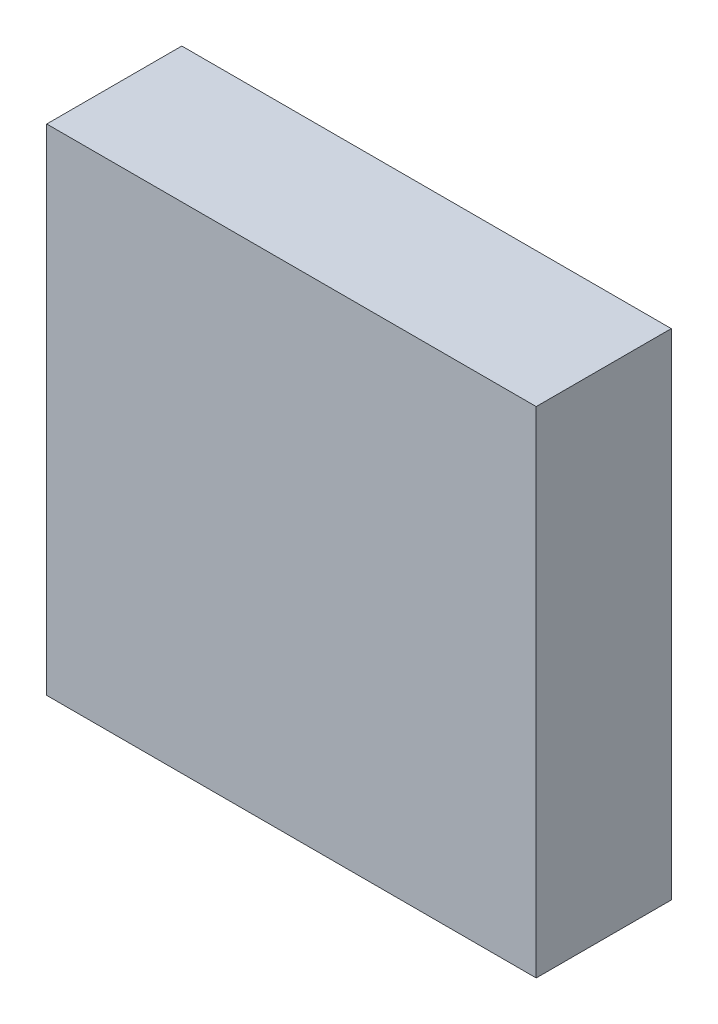
ISO-10303-21;
HEADER;
FILE_DESCRIPTION(('STEP AP214'),'2;1');
FILE_NAME('part.step','',(''),(''),'','','');
FILE_SCHEMA(('AUTOMOTIVE_DESIGN { 1 0 10303 214 1 1 1 1 }'));
ENDSEC;
DATA;
#1=APPLICATION_CONTEXT('core data for automotive mechanical design processes');
#2=APPLICATION_PROTOCOL_DEFINITION('international standard','automotive_design',2000,#1);
#3=PRODUCT_CONTEXT('',#1,'mechanical');
#4=PRODUCT('Part','Part','',(#3));
#5=PRODUCT_RELATED_PRODUCT_CATEGORY('part','',(#4));
#6=PRODUCT_DEFINITION_FORMATION('','',#4);
#7=PRODUCT_DEFINITION_CONTEXT('part definition',#1,'design');
#8=PRODUCT_DEFINITION('design','',#6,#7);
#9=PRODUCT_DEFINITION_SHAPE('','',#8);
#10=(LENGTH_UNIT() NAMED_UNIT(*) SI_UNIT(.MILLI.,.METRE.));
#11=(NAMED_UNIT(*) PLANE_ANGLE_UNIT() SI_UNIT($,.RADIAN.));
#12=(NAMED_UNIT(*) SI_UNIT($,.STERADIAN.) SOLID_ANGLE_UNIT());
#13=UNCERTAINTY_MEASURE_WITH_UNIT(LENGTH_MEASURE(1.E-05),#10,'distance_accuracy_value','');
#14=(GEOMETRIC_REPRESENTATION_CONTEXT(3) GLOBAL_UNCERTAINTY_ASSIGNED_CONTEXT((#13)) GLOBAL_UNIT_ASSIGNED_CONTEXT((#10,
#11,#12)) REPRESENTATION_CONTEXT('',''));
#15=CARTESIAN_POINT('',(0.,0.,0.));
#16=DIRECTION('',(0.,0.,1.));
#17=DIRECTION('',(1.,0.,0.));
#18=AXIS2_PLACEMENT_3D('',#15,#16,#17);
#19=CARTESIAN_POINT('',(-39.0635,-39.4635,21.54));
#20=DIRECTION('',(1.,0.,0.));
#21=DIRECTION('',(0.,0.,-1.));
#22=AXIS2_PLACEMENT_3D('',#19,#20,#21);
#23=PLANE('',#22);
#24=DIRECTION('',(0.,-1.,0.));
#25=VECTOR('',#24,1.);
#26=CARTESIAN_POINT('',(-39.0635,-39.4635,0.));
#27=LINE('',#26,#25);
#28=CARTESIAN_POINT('',(-39.0635,39.4635,0.));
#29=VERTEX_POINT('',#28);
#30=CARTESIAN_POINT('',(-39.0635,-39.4635,0.));
#31=VERTEX_POINT('',#30);
#32=EDGE_CURVE('E96',#29,#31,#27,.T.);
#33=ORIENTED_EDGE('',*,*,#32,.T.);
#34=DIRECTION('',(0.,0.,-1.));
#35=VECTOR('',#34,1.);
#36=CARTESIAN_POINT('',(-39.0635,-39.4635,21.54));
#37=LINE('',#36,#35);
#38=CARTESIAN_POINT('',(-39.0635,-39.4635,21.54));
#39=VERTEX_POINT('',#38);
#40=EDGE_CURVE('E11',#39,#31,#37,.T.);
#41=ORIENTED_EDGE('',*,*,#40,.F.);
#42=DIRECTION('',(0.,-1.,0.));
#43=VECTOR('',#42,1.);
#44=CARTESIAN_POINT('',(-39.0635,-39.4635,21.54));
#45=LINE('',#44,#43);
#46=CARTESIAN_POINT('',(-39.0635,39.4635,21.54));
#47=VERTEX_POINT('',#46);
#48=EDGE_CURVE('E84',#47,#39,#45,.T.);
#49=ORIENTED_EDGE('',*,*,#48,.F.);
#50=DIRECTION('',(0.,0.,-1.));
#51=VECTOR('',#50,1.);
#52=CARTESIAN_POINT('',(-39.0635,39.4635,21.54));
#53=LINE('',#52,#51);
#54=EDGE_CURVE('E92',#47,#29,#53,.T.);
#55=ORIENTED_EDGE('',*,*,#54,.T.);
#56=EDGE_LOOP('',(#33,#41,#49,#55));
#57=FACE_BOUND('',#56,.T.);
#58=ADVANCED_FACE('F33',(#57),#23,.F.);
#59=CARTESIAN_POINT('',(39.,-39.4635,21.54));
#60=DIRECTION('',(0.,1.,0.));
#61=DIRECTION('',(0.,0.,1.));
#62=AXIS2_PLACEMENT_3D('',#59,#60,#61);
#63=PLANE('',#62);
#64=DIRECTION('',(1.,0.,0.));
#65=VECTOR('',#64,1.);
#66=CARTESIAN_POINT('',(39.,-39.4635,0.));
#67=LINE('',#66,#65);
#68=CARTESIAN_POINT('',(39.,-39.4635,0.));
#69=VERTEX_POINT('',#68);
#70=EDGE_CURVE('E88',#31,#69,#67,.T.);
#71=ORIENTED_EDGE('',*,*,#70,.T.);
#72=DIRECTION('',(0.,0.,-1.));
#73=VECTOR('',#72,1.);
#74=CARTESIAN_POINT('',(39.,-39.4635,21.54));
#75=LINE('',#74,#73);
#76=CARTESIAN_POINT('',(39.,-39.4635,21.54));
#77=VERTEX_POINT('',#76);
#78=EDGE_CURVE('E41',#77,#69,#75,.T.);
#79=ORIENTED_EDGE('',*,*,#78,.F.);
#80=DIRECTION('',(1.,0.,0.));
#81=VECTOR('',#80,1.);
#82=CARTESIAN_POINT('',(39.,-39.4635,21.54));
#83=LINE('',#82,#81);
#84=EDGE_CURVE('E79',#39,#77,#83,.T.);
#85=ORIENTED_EDGE('',*,*,#84,.F.);
#86=ORIENTED_EDGE('',*,*,#40,.T.);
#87=EDGE_LOOP('',(#71,#79,#85,#86));
#88=FACE_BOUND('',#87,.T.);
#89=ADVANCED_FACE('F87',(#88),#63,.F.);
#90=CARTESIAN_POINT('',(39.,39.4635,21.54));
#91=DIRECTION('',(-1.,0.,0.));
#92=DIRECTION('',(0.,0.,1.));
#93=AXIS2_PLACEMENT_3D('',#90,#91,#92);
#94=PLANE('',#93);
#95=DIRECTION('',(0.,1.,0.));
#96=VECTOR('',#95,1.);
#97=CARTESIAN_POINT('',(39.,39.4635,0.));
#98=LINE('',#97,#96);
#99=CARTESIAN_POINT('',(39.,39.4635,0.));
#100=VERTEX_POINT('',#99);
#101=EDGE_CURVE('E66',#69,#100,#98,.T.);
#102=ORIENTED_EDGE('',*,*,#101,.T.);
#103=DIRECTION('',(0.,0.,-1.));
#104=VECTOR('',#103,1.);
#105=CARTESIAN_POINT('',(39.,39.4635,21.54));
#106=LINE('',#105,#104);
#107=CARTESIAN_POINT('',(39.,39.4635,21.54));
#108=VERTEX_POINT('',#107);
#109=EDGE_CURVE('E89',#108,#100,#106,.T.);
#110=ORIENTED_EDGE('',*,*,#109,.F.);
#111=DIRECTION('',(0.,1.,0.));
#112=VECTOR('',#111,1.);
#113=CARTESIAN_POINT('',(39.,39.4635,21.54));
#114=LINE('',#113,#112);
#115=EDGE_CURVE('E82',#77,#108,#114,.T.);
#116=ORIENTED_EDGE('',*,*,#115,.F.);
#117=ORIENTED_EDGE('',*,*,#78,.T.);
#118=EDGE_LOOP('',(#102,#110,#116,#117));
#119=FACE_BOUND('',#118,.T.);
#120=ADVANCED_FACE('F90',(#119),#94,.F.);
#121=CARTESIAN_POINT('',(-39.0635,39.4635,21.54));
#122=DIRECTION('',(0.,-1.,0.));
#123=DIRECTION('',(0.,0.,-1.));
#124=AXIS2_PLACEMENT_3D('',#121,#122,#123);
#125=PLANE('',#124);
#126=DIRECTION('',(-1.,0.,0.));
#127=VECTOR('',#126,1.);
#128=CARTESIAN_POINT('',(-39.0635,39.4635,0.));
#129=LINE('',#128,#127);
#130=EDGE_CURVE('E72',#100,#29,#129,.T.);
#131=ORIENTED_EDGE('',*,*,#130,.T.);
#132=ORIENTED_EDGE('',*,*,#54,.F.);
#133=DIRECTION('',(-1.,0.,0.));
#134=VECTOR('',#133,1.);
#135=CARTESIAN_POINT('',(-39.0635,39.4635,21.54));
#136=LINE('',#135,#134);
#137=EDGE_CURVE('E49',#108,#47,#136,.T.);
#138=ORIENTED_EDGE('',*,*,#137,.F.);
#139=ORIENTED_EDGE('',*,*,#109,.T.);
#140=EDGE_LOOP('',(#131,#132,#138,#139));
#141=FACE_BOUND('',#140,.T.);
#142=ADVANCED_FACE('F103',(#141),#125,.F.);
#143=CARTESIAN_POINT('',(0.,0.,21.54));
#144=DIRECTION('',(0.,0.,-1.));
#145=DIRECTION('',(-1.,0.,0.));
#146=AXIS2_PLACEMENT_3D('',#143,#144,#145);
#147=PLANE('',#146);
#148=ORIENTED_EDGE('',*,*,#48,.T.);
#149=ORIENTED_EDGE('',*,*,#84,.T.);
#150=ORIENTED_EDGE('',*,*,#115,.T.);
#151=ORIENTED_EDGE('',*,*,#137,.T.);
#152=EDGE_LOOP('',(#148,#149,#150,#151));
#153=FACE_BOUND('',#152,.T.);
#154=ADVANCED_FACE('F80',(#153),#147,.F.);
#155=CARTESIAN_POINT('',(0.,0.,0.));
#156=DIRECTION('',(0.,0.,-1.));
#157=DIRECTION('',(-1.,0.,0.));
#158=AXIS2_PLACEMENT_3D('',#155,#156,#157);
#159=PLANE('',#158);
#160=ORIENTED_EDGE('',*,*,#32,.F.);
#161=ORIENTED_EDGE('',*,*,#130,.F.);
#162=ORIENTED_EDGE('',*,*,#101,.F.);
#163=ORIENTED_EDGE('',*,*,#70,.F.);
#164=EDGE_LOOP('',(#160,#161,#162,#163));
#165=FACE_BOUND('',#164,.T.);
#166=ADVANCED_FACE('F106',(#165),#159,.T.);
#167=CLOSED_SHELL('',(#58,#89,#120,#142,#154,#166));
#168=MANIFOLD_SOLID_BREP('B2',#167);
#169=ADVANCED_BREP_SHAPE_REPRESENTATION('',(#18,#168),#14);
#170=SHAPE_DEFINITION_REPRESENTATION(#9,#169);
ENDSEC;
END-ISO-10303-21;
